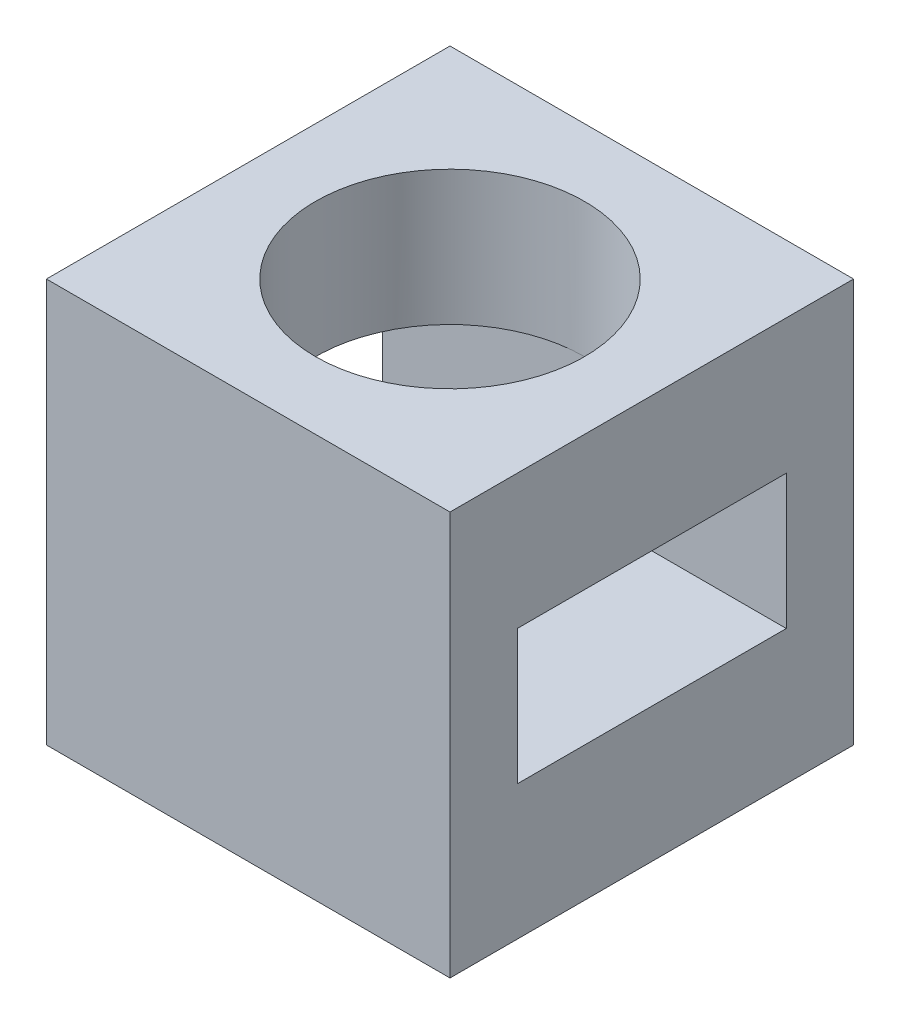
ISO-10303-21;
HEADER;
FILE_DESCRIPTION(('STEP AP214'),'2;1');
FILE_NAME('part.step','',(''),(''),'','','');
FILE_SCHEMA(('AUTOMOTIVE_DESIGN { 1 0 10303 214 1 1 1 1 }'));
ENDSEC;
DATA;
#1=APPLICATION_CONTEXT('core data for automotive mechanical design processes');
#2=APPLICATION_PROTOCOL_DEFINITION('international standard','automotive_design',2000,#1);
#3=PRODUCT_CONTEXT('',#1,'mechanical');
#4=PRODUCT('Part','Part','',(#3));
#5=PRODUCT_RELATED_PRODUCT_CATEGORY('part','',(#4));
#6=PRODUCT_DEFINITION_FORMATION('','',#4);
#7=PRODUCT_DEFINITION_CONTEXT('part definition',#1,'design');
#8=PRODUCT_DEFINITION('design','',#6,#7);
#9=PRODUCT_DEFINITION_SHAPE('','',#8);
#10=(LENGTH_UNIT() NAMED_UNIT(*) SI_UNIT(.MILLI.,.METRE.));
#11=(NAMED_UNIT(*) PLANE_ANGLE_UNIT() SI_UNIT($,.RADIAN.));
#12=(NAMED_UNIT(*) SI_UNIT($,.STERADIAN.) SOLID_ANGLE_UNIT());
#13=UNCERTAINTY_MEASURE_WITH_UNIT(LENGTH_MEASURE(1.E-05),#10,'distance_accuracy_value','');
#14=(GEOMETRIC_REPRESENTATION_CONTEXT(3) GLOBAL_UNCERTAINTY_ASSIGNED_CONTEXT((#13)) GLOBAL_UNIT_ASSIGNED_CONTEXT((#10,
#11,#12)) REPRESENTATION_CONTEXT('',''));
#15=CARTESIAN_POINT('',(0.,0.,0.));
#16=DIRECTION('',(0.,0.,1.));
#17=DIRECTION('',(1.,0.,0.));
#18=AXIS2_PLACEMENT_3D('',#15,#16,#17);
#19=CARTESIAN_POINT('',(150.,25.,50.));
#20=DIRECTION('',(0.,-1.,0.));
#21=DIRECTION('',(0.,0.,-1.));
#22=AXIS2_PLACEMENT_3D('',#19,#20,#21);
#23=PLANE('',#22);
#24=CARTESIAN_POINT('',(75.,25.,0.));
#25=DIRECTION('',(0.,1.,0.));
#26=DIRECTION('',(0.,0.,1.));
#27=AXIS2_PLACEMENT_3D('',#24,#25,#26);
#28=CIRCLE('',#27,50.);
#29=CARTESIAN_POINT('',(75.,25.,50.));
#30=VERTEX_POINT('',#29);
#31=CARTESIAN_POINT('',(75.,25.,-50.));
#32=VERTEX_POINT('',#31);
#33=EDGE_CURVE('E53',#30,#32,#28,.T.);
#34=ORIENTED_EDGE('',*,*,#33,.T.);
#35=DIRECTION('',(-1.,0.,0.));
#36=VECTOR('',#35,1.);
#37=CARTESIAN_POINT('',(150.,25.,-50.));
#38=LINE('',#37,#36);
#39=CARTESIAN_POINT('',(150.,25.,-50.));
#40=VERTEX_POINT('',#39);
#41=EDGE_CURVE('E119',#40,#32,#38,.T.);
#42=ORIENTED_EDGE('',*,*,#41,.F.);
#43=DIRECTION('',(0.,0.,1.));
#44=VECTOR('',#43,1.);
#45=CARTESIAN_POINT('',(150.,25.,50.));
#46=LINE('',#45,#44);
#47=CARTESIAN_POINT('',(150.,25.,50.));
#48=VERTEX_POINT('',#47);
#49=EDGE_CURVE('E301',#40,#48,#46,.T.);
#50=ORIENTED_EDGE('',*,*,#49,.T.);
#51=DIRECTION('',(-1.,0.,0.));
#52=VECTOR('',#51,1.);
#53=CARTESIAN_POINT('',(150.,25.,50.));
#54=LINE('',#53,#52);
#55=EDGE_CURVE('E122',#48,#30,#54,.T.);
#56=ORIENTED_EDGE('',*,*,#55,.T.);
#57=EDGE_LOOP('',(#34,#42,#50,#56));
#58=FACE_BOUND('',#57,.T.);
#59=ADVANCED_FACE('F39',(#58),#23,.T.);
#60=CARTESIAN_POINT('',(150.,0.,0.));
#61=DIRECTION('',(1.,0.,0.));
#62=DIRECTION('',(0.,0.,-1.));
#63=AXIS2_PLACEMENT_3D('',#60,#61,#62);
#64=PLANE('',#63);
#65=DIRECTION('',(0.,1.,0.));
#66=VECTOR('',#65,1.);
#67=CARTESIAN_POINT('',(150.,75.,-75.));
#68=LINE('',#67,#66);
#69=CARTESIAN_POINT('',(150.,-75.,-75.));
#70=VERTEX_POINT('',#69);
#71=CARTESIAN_POINT('',(150.,75.,-75.));
#72=VERTEX_POINT('',#71);
#73=EDGE_CURVE('E143',#70,#72,#68,.T.);
#74=ORIENTED_EDGE('',*,*,#73,.T.);
#75=DIRECTION('',(0.,0.,1.));
#76=VECTOR('',#75,1.);
#77=CARTESIAN_POINT('',(150.,75.,75.));
#78=LINE('',#77,#76);
#79=CARTESIAN_POINT('',(150.,75.,75.));
#80=VERTEX_POINT('',#79);
#81=EDGE_CURVE('E146',#72,#80,#78,.T.);
#82=ORIENTED_EDGE('',*,*,#81,.T.);
#83=DIRECTION('',(0.,-1.,0.));
#84=VECTOR('',#83,1.);
#85=CARTESIAN_POINT('',(150.,75.,75.));
#86=LINE('',#85,#84);
#87=CARTESIAN_POINT('',(150.,-75.,75.));
#88=VERTEX_POINT('',#87);
#89=EDGE_CURVE('E149',#80,#88,#86,.T.);
#90=ORIENTED_EDGE('',*,*,#89,.T.);
#91=DIRECTION('',(0.,0.,-1.));
#92=VECTOR('',#91,1.);
#93=CARTESIAN_POINT('',(150.,-75.,75.));
#94=LINE('',#93,#92);
#95=EDGE_CURVE('E151',#88,#70,#94,.T.);
#96=ORIENTED_EDGE('',*,*,#95,.T.);
#97=EDGE_LOOP('',(#74,#82,#90,#96));
#98=FACE_BOUND('',#97,.T.);
#99=ORIENTED_EDGE('',*,*,#49,.F.);
#100=DIRECTION('',(0.,1.,0.));
#101=VECTOR('',#100,1.);
#102=CARTESIAN_POINT('',(150.,25.,-50.));
#103=LINE('',#102,#101);
#104=CARTESIAN_POINT('',(150.,-25.,-50.));
#105=VERTEX_POINT('',#104);
#106=EDGE_CURVE('E135',#105,#40,#103,.T.);
#107=ORIENTED_EDGE('',*,*,#106,.F.);
#108=DIRECTION('',(0.,0.,-1.));
#109=VECTOR('',#108,1.);
#110=CARTESIAN_POINT('',(150.,-25.,50.));
#111=LINE('',#110,#109);
#112=CARTESIAN_POINT('',(150.,-25.,50.));
#113=VERTEX_POINT('',#112);
#114=EDGE_CURVE('E296',#113,#105,#111,.T.);
#115=ORIENTED_EDGE('',*,*,#114,.F.);
#116=DIRECTION('',(0.,-1.,0.));
#117=VECTOR('',#116,1.);
#118=CARTESIAN_POINT('',(150.,25.,50.));
#119=LINE('',#118,#117);
#120=EDGE_CURVE('E299',#48,#113,#119,.T.);
#121=ORIENTED_EDGE('',*,*,#120,.F.);
#122=EDGE_LOOP('',(#99,#107,#115,#121));
#123=FACE_BOUND('',#122,.T.);
#124=ADVANCED_FACE('F183',(#98,#123),#64,.T.);
#125=CARTESIAN_POINT('',(0.,0.,0.));
#126=DIRECTION('',(1.,0.,0.));
#127=DIRECTION('',(0.,0.,-1.));
#128=AXIS2_PLACEMENT_3D('',#125,#126,#127);
#129=PLANE('',#128);
#130=DIRECTION('',(0.,1.,0.));
#131=VECTOR('',#130,1.);
#132=CARTESIAN_POINT('',(0.,75.,-75.));
#133=LINE('',#132,#131);
#134=CARTESIAN_POINT('',(0.,-75.,-75.));
#135=VERTEX_POINT('',#134);
#136=CARTESIAN_POINT('',(0.,75.,-75.));
#137=VERTEX_POINT('',#136);
#138=EDGE_CURVE('E136',#135,#137,#133,.T.);
#139=ORIENTED_EDGE('',*,*,#138,.F.);
#140=DIRECTION('',(0.,0.,-1.));
#141=VECTOR('',#140,1.);
#142=CARTESIAN_POINT('',(0.,-75.,75.));
#143=LINE('',#142,#141);
#144=CARTESIAN_POINT('',(0.,-75.,75.));
#145=VERTEX_POINT('',#144);
#146=EDGE_CURVE('E147',#145,#135,#143,.T.);
#147=ORIENTED_EDGE('',*,*,#146,.F.);
#148=DIRECTION('',(0.,-1.,0.));
#149=VECTOR('',#148,1.);
#150=CARTESIAN_POINT('',(0.,75.,75.));
#151=LINE('',#150,#149);
#152=CARTESIAN_POINT('',(0.,75.,75.));
#153=VERTEX_POINT('',#152);
#154=EDGE_CURVE('E155',#153,#145,#151,.T.);
#155=ORIENTED_EDGE('',*,*,#154,.F.);
#156=DIRECTION('',(0.,0.,1.));
#157=VECTOR('',#156,1.);
#158=CARTESIAN_POINT('',(0.,75.,75.));
#159=LINE('',#158,#157);
#160=EDGE_CURVE('E138',#137,#153,#159,.T.);
#161=ORIENTED_EDGE('',*,*,#160,.F.);
#162=EDGE_LOOP('',(#139,#147,#155,#161));
#163=FACE_BOUND('',#162,.T.);
#164=DIRECTION('',(0.,1.,0.));
#165=VECTOR('',#164,1.);
#166=CARTESIAN_POINT('',(0.,25.,-50.));
#167=LINE('',#166,#165);
#168=CARTESIAN_POINT('',(0.,-25.,-50.));
#169=VERTEX_POINT('',#168);
#170=CARTESIAN_POINT('',(0.,25.,-50.));
#171=VERTEX_POINT('',#170);
#172=EDGE_CURVE('E123',#169,#171,#167,.T.);
#173=ORIENTED_EDGE('',*,*,#172,.T.);
#174=DIRECTION('',(0.,0.,1.));
#175=VECTOR('',#174,1.);
#176=CARTESIAN_POINT('',(0.,25.,50.));
#177=LINE('',#176,#175);
#178=CARTESIAN_POINT('',(0.,25.,50.));
#179=VERTEX_POINT('',#178);
#180=EDGE_CURVE('E128',#171,#179,#177,.T.);
#181=ORIENTED_EDGE('',*,*,#180,.T.);
#182=DIRECTION('',(0.,-1.,0.));
#183=VECTOR('',#182,1.);
#184=CARTESIAN_POINT('',(0.,25.,50.));
#185=LINE('',#184,#183);
#186=CARTESIAN_POINT('',(0.,-25.,50.));
#187=VERTEX_POINT('',#186);
#188=EDGE_CURVE('E289',#179,#187,#185,.T.);
#189=ORIENTED_EDGE('',*,*,#188,.T.);
#190=DIRECTION('',(0.,0.,-1.));
#191=VECTOR('',#190,1.);
#192=CARTESIAN_POINT('',(0.,-25.,50.));
#193=LINE('',#192,#191);
#194=EDGE_CURVE('E286',#187,#169,#193,.T.);
#195=ORIENTED_EDGE('',*,*,#194,.T.);
#196=EDGE_LOOP('',(#173,#181,#189,#195));
#197=FACE_BOUND('',#196,.T.);
#198=ADVANCED_FACE('F173',(#163,#197),#129,.F.);
#199=CARTESIAN_POINT('',(150.,75.,-75.));
#200=DIRECTION('',(0.,0.,1.));
#201=DIRECTION('',(0.,-1.,0.));
#202=AXIS2_PLACEMENT_3D('',#199,#200,#201);
#203=PLANE('',#202);
#204=ORIENTED_EDGE('',*,*,#138,.T.);
#205=DIRECTION('',(-1.,0.,0.));
#206=VECTOR('',#205,1.);
#207=CARTESIAN_POINT('',(150.,75.,-75.));
#208=LINE('',#207,#206);
#209=EDGE_CURVE('E11',#72,#137,#208,.T.);
#210=ORIENTED_EDGE('',*,*,#209,.F.);
#211=ORIENTED_EDGE('',*,*,#73,.F.);
#212=DIRECTION('',(-1.,0.,0.));
#213=VECTOR('',#212,1.);
#214=CARTESIAN_POINT('',(150.,-75.,-75.));
#215=LINE('',#214,#213);
#216=EDGE_CURVE('E152',#70,#135,#215,.T.);
#217=ORIENTED_EDGE('',*,*,#216,.T.);
#218=EDGE_LOOP('',(#204,#210,#211,#217));
#219=FACE_BOUND('',#218,.T.);
#220=ADVANCED_FACE('F41',(#219),#203,.F.);
#221=CARTESIAN_POINT('',(150.,75.,75.));
#222=DIRECTION('',(0.,-1.,0.));
#223=DIRECTION('',(0.,0.,-1.));
#224=AXIS2_PLACEMENT_3D('',#221,#222,#223);
#225=PLANE('',#224);
#226=CARTESIAN_POINT('',(75.,75.,0.));
#227=DIRECTION('',(0.,1.,0.));
#228=DIRECTION('',(0.,0.,1.));
#229=AXIS2_PLACEMENT_3D('',#226,#227,#228);
#230=CIRCLE('',#229,50.);
#231=CARTESIAN_POINT('',(75.,75.,50.));
#232=VERTEX_POINT('',#231);
#233=EDGE_CURVE('E113',#232,#232,#230,.T.);
#234=ORIENTED_EDGE('',*,*,#233,.F.);
#235=EDGE_LOOP('',(#234));
#236=FACE_BOUND('',#235,.T.);
#237=ORIENTED_EDGE('',*,*,#160,.T.);
#238=DIRECTION('',(-1.,0.,0.));
#239=VECTOR('',#238,1.);
#240=CARTESIAN_POINT('',(150.,75.,75.));
#241=LINE('',#240,#239);
#242=EDGE_CURVE('E47',#80,#153,#241,.T.);
#243=ORIENTED_EDGE('',*,*,#242,.F.);
#244=ORIENTED_EDGE('',*,*,#81,.F.);
#245=ORIENTED_EDGE('',*,*,#209,.T.);
#246=EDGE_LOOP('',(#237,#243,#244,#245));
#247=FACE_BOUND('',#246,.T.);
#248=ADVANCED_FACE('F185',(#236,#247),#225,.F.);
#249=CARTESIAN_POINT('',(150.,75.,75.));
#250=DIRECTION('',(0.,0.,-1.));
#251=DIRECTION('',(0.,1.,0.));
#252=AXIS2_PLACEMENT_3D('',#249,#250,#251);
#253=PLANE('',#252);
#254=ORIENTED_EDGE('',*,*,#154,.T.);
#255=DIRECTION('',(-1.,0.,0.));
#256=VECTOR('',#255,1.);
#257=CARTESIAN_POINT('',(150.,-75.,75.));
#258=LINE('',#257,#256);
#259=EDGE_CURVE('E160',#88,#145,#258,.T.);
#260=ORIENTED_EDGE('',*,*,#259,.F.);
#261=ORIENTED_EDGE('',*,*,#89,.F.);
#262=ORIENTED_EDGE('',*,*,#242,.T.);
#263=EDGE_LOOP('',(#254,#260,#261,#262));
#264=FACE_BOUND('',#263,.T.);
#265=ADVANCED_FACE('F167',(#264),#253,.F.);
#266=CARTESIAN_POINT('',(150.,-75.,75.));
#267=DIRECTION('',(0.,1.,0.));
#268=DIRECTION('',(0.,0.,1.));
#269=AXIS2_PLACEMENT_3D('',#266,#267,#268);
#270=PLANE('',#269);
#271=ORIENTED_EDGE('',*,*,#146,.T.);
#272=ORIENTED_EDGE('',*,*,#216,.F.);
#273=ORIENTED_EDGE('',*,*,#95,.F.);
#274=ORIENTED_EDGE('',*,*,#259,.T.);
#275=EDGE_LOOP('',(#271,#272,#273,#274));
#276=FACE_BOUND('',#275,.T.);
#277=ADVANCED_FACE('F177',(#276),#270,.F.);
#278=CARTESIAN_POINT('',(150.,25.,-50.));
#279=DIRECTION('',(0.,0.,1.));
#280=DIRECTION('',(0.,-1.,0.));
#281=AXIS2_PLACEMENT_3D('',#278,#279,#280);
#282=PLANE('',#281);
#283=ORIENTED_EDGE('',*,*,#172,.F.);
#284=DIRECTION('',(-1.,0.,0.));
#285=VECTOR('',#284,1.);
#286=CARTESIAN_POINT('',(150.,-25.,-50.));
#287=LINE('',#286,#285);
#288=EDGE_CURVE('E288',#105,#169,#287,.T.);
#289=ORIENTED_EDGE('',*,*,#288,.F.);
#290=ORIENTED_EDGE('',*,*,#106,.T.);
#291=ORIENTED_EDGE('',*,*,#41,.T.);
#292=EDGE_CURVE('E125',#32,#171,#38,.T.);
#293=ORIENTED_EDGE('',*,*,#292,.T.);
#294=EDGE_LOOP('',(#283,#289,#290,#291,#293));
#295=FACE_BOUND('',#294,.T.);
#296=ADVANCED_FACE('F132',(#295),#282,.T.);
#297=EDGE_CURVE('E107',#32,#30,#28,.T.);
#298=ORIENTED_EDGE('',*,*,#297,.T.);
#299=EDGE_CURVE('E297',#30,#179,#54,.T.);
#300=ORIENTED_EDGE('',*,*,#299,.T.);
#301=ORIENTED_EDGE('',*,*,#180,.F.);
#302=ORIENTED_EDGE('',*,*,#292,.F.);
#303=EDGE_LOOP('',(#298,#300,#301,#302));
#304=FACE_BOUND('',#303,.T.);
#305=ADVANCED_FACE('F126',(#304),#23,.T.);
#306=CARTESIAN_POINT('',(150.,25.,50.));
#307=DIRECTION('',(0.,0.,-1.));
#308=DIRECTION('',(0.,1.,0.));
#309=AXIS2_PLACEMENT_3D('',#306,#307,#308);
#310=PLANE('',#309);
#311=ORIENTED_EDGE('',*,*,#188,.F.);
#312=ORIENTED_EDGE('',*,*,#299,.F.);
#313=ORIENTED_EDGE('',*,*,#55,.F.);
#314=ORIENTED_EDGE('',*,*,#120,.T.);
#315=DIRECTION('',(-1.,0.,0.));
#316=VECTOR('',#315,1.);
#317=CARTESIAN_POINT('',(150.,-25.,50.));
#318=LINE('',#317,#316);
#319=EDGE_CURVE('E61',#113,#187,#318,.T.);
#320=ORIENTED_EDGE('',*,*,#319,.T.);
#321=EDGE_LOOP('',(#311,#312,#313,#314,#320));
#322=FACE_BOUND('',#321,.T.);
#323=ADVANCED_FACE('F205',(#322),#310,.T.);
#324=CARTESIAN_POINT('',(150.,-25.,50.));
#325=DIRECTION('',(0.,1.,0.));
#326=DIRECTION('',(0.,0.,1.));
#327=AXIS2_PLACEMENT_3D('',#324,#325,#326);
#328=PLANE('',#327);
#329=ORIENTED_EDGE('',*,*,#194,.F.);
#330=ORIENTED_EDGE('',*,*,#319,.F.);
#331=ORIENTED_EDGE('',*,*,#114,.T.);
#332=ORIENTED_EDGE('',*,*,#288,.T.);
#333=EDGE_LOOP('',(#329,#330,#331,#332));
#334=FACE_BOUND('',#333,.T.);
#335=ADVANCED_FACE('F209',(#334),#328,.T.);
#336=CARTESIAN_POINT('',(75.,25.,0.));
#337=DIRECTION('',(0.,1.,0.));
#338=DIRECTION('',(0.,0.,1.));
#339=AXIS2_PLACEMENT_3D('',#336,#337,#338);
#340=CYLINDRICAL_SURFACE('',#339,50.);
#341=ORIENTED_EDGE('',*,*,#33,.F.);
#342=ORIENTED_EDGE('',*,*,#297,.F.);
#343=EDGE_LOOP('',(#341,#342));
#344=FACE_BOUND('',#343,.T.);
#345=ORIENTED_EDGE('',*,*,#233,.T.);
#346=EDGE_LOOP('',(#345));
#347=FACE_BOUND('',#346,.T.);
#348=ADVANCED_FACE('F108',(#344,#347),#340,.F.);
#349=CLOSED_SHELL('',(#59,#124,#198,#220,#248,#265,#277,#296,#305,#323,#335,#348));
#350=MANIFOLD_SOLID_BREP('B2',#349);
#351=ADVANCED_BREP_SHAPE_REPRESENTATION('',(#18,#350),#14);
#352=SHAPE_DEFINITION_REPRESENTATION(#9,#351);
ENDSEC;
END-ISO-10303-21;
